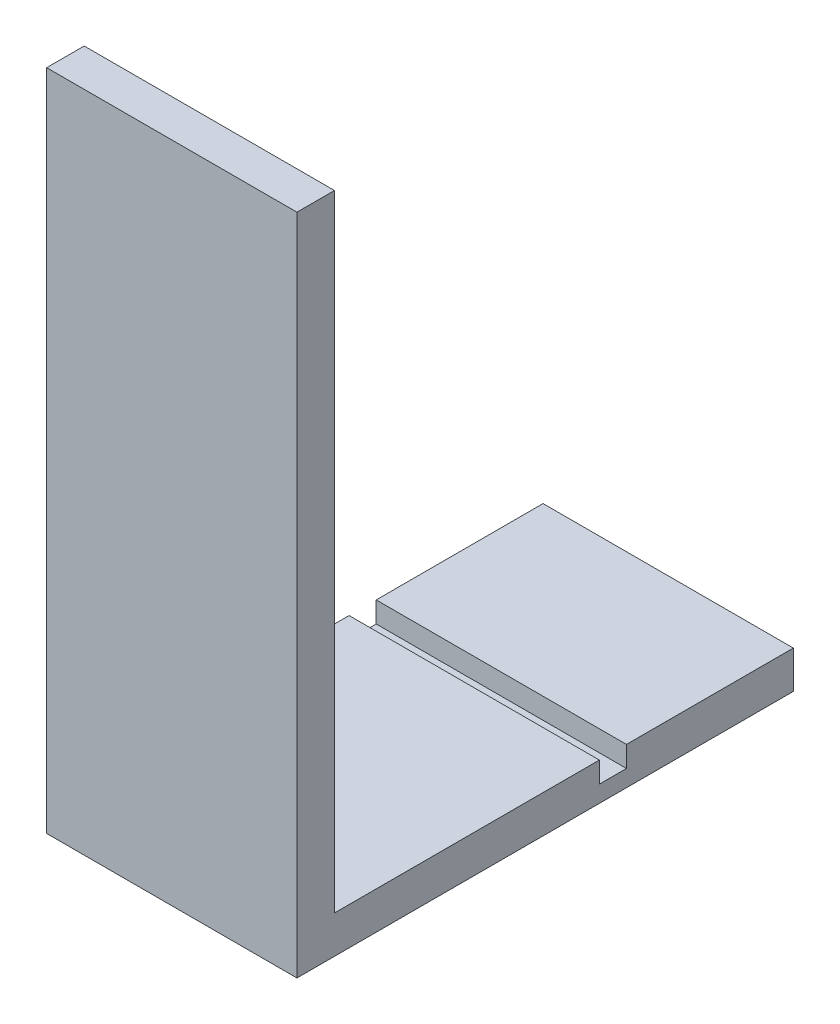
ISO-10303-21;
HEADER;
FILE_DESCRIPTION(('STEP AP214'),'2;1');
FILE_NAME('part.step','',(''),(''),'','','');
FILE_SCHEMA(('AUTOMOTIVE_DESIGN { 1 0 10303 214 1 1 1 1 }'));
ENDSEC;
DATA;
#1=APPLICATION_CONTEXT('core data for automotive mechanical design processes');
#2=APPLICATION_PROTOCOL_DEFINITION('international standard','automotive_design',2000,#1);
#3=PRODUCT_CONTEXT('',#1,'mechanical');
#4=PRODUCT('Part','Part','',(#3));
#5=PRODUCT_RELATED_PRODUCT_CATEGORY('part','',(#4));
#6=PRODUCT_DEFINITION_FORMATION('','',#4);
#7=PRODUCT_DEFINITION_CONTEXT('part definition',#1,'design');
#8=PRODUCT_DEFINITION('design','',#6,#7);
#9=PRODUCT_DEFINITION_SHAPE('','',#8);
#10=(LENGTH_UNIT() NAMED_UNIT(*) SI_UNIT(.MILLI.,.METRE.));
#11=(NAMED_UNIT(*) PLANE_ANGLE_UNIT() SI_UNIT($,.RADIAN.));
#12=(NAMED_UNIT(*) SI_UNIT($,.STERADIAN.) SOLID_ANGLE_UNIT());
#13=UNCERTAINTY_MEASURE_WITH_UNIT(LENGTH_MEASURE(1.E-05),#10,'distance_accuracy_value','');
#14=(GEOMETRIC_REPRESENTATION_CONTEXT(3) GLOBAL_UNCERTAINTY_ASSIGNED_CONTEXT((#13)) GLOBAL_UNIT_ASSIGNED_CONTEXT((#10,
#11,#12)) REPRESENTATION_CONTEXT('',''));
#15=CARTESIAN_POINT('',(0.,0.,0.));
#16=DIRECTION('',(0.,0.,1.));
#17=DIRECTION('',(1.,0.,0.));
#18=AXIS2_PLACEMENT_3D('',#15,#16,#17);
#19=CARTESIAN_POINT('',(120.,-58.6666666666666,-58.3333333333335));
#20=DIRECTION('',(0.,-1.,0.));
#21=DIRECTION('',(0.,0.,-1.));
#22=AXIS2_PLACEMENT_3D('',#19,#20,#21);
#23=PLANE('',#22);
#24=DIRECTION('',(0.,0.,1.));
#25=VECTOR('',#24,1.);
#26=CARTESIAN_POINT('',(0.,-58.6666666666666,-58.3333333333335));
#27=LINE('',#26,#25);
#28=CARTESIAN_POINT('',(0.,-58.6666666666666,-58.3333333333335));
#29=VERTEX_POINT('',#28);
#30=CARTESIAN_POINT('',(0.,-58.6666666666666,21.6666666666665));
#31=VERTEX_POINT('',#30);
#32=EDGE_CURVE('E166',#29,#31,#27,.T.);
#33=ORIENTED_EDGE('',*,*,#32,.T.);
#34=DIRECTION('',(1.,0.,0.));
#35=VECTOR('',#34,1.);
#36=CARTESIAN_POINT('',(0.,-58.6666666666666,21.6666666666665));
#37=LINE('',#36,#35);
#38=CARTESIAN_POINT('',(120.,-58.6666666666666,21.6666666666665));
#39=VERTEX_POINT('',#38);
#40=EDGE_CURVE('E144',#31,#39,#37,.T.);
#41=ORIENTED_EDGE('',*,*,#40,.T.);
#42=DIRECTION('',(0.,0.,1.));
#43=VECTOR('',#42,1.);
#44=CARTESIAN_POINT('',(120.,-58.6666666666666,-58.3333333333335));
#45=LINE('',#44,#43);
#46=CARTESIAN_POINT('',(120.,-58.6666666666666,-58.3333333333335));
#47=VERTEX_POINT('',#46);
#48=EDGE_CURVE('E121',#47,#39,#45,.T.);
#49=ORIENTED_EDGE('',*,*,#48,.F.);
#50=DIRECTION('',(-1.,0.,0.));
#51=VECTOR('',#50,1.);
#52=CARTESIAN_POINT('',(120.,-58.6666666666666,-58.3333333333335));
#53=LINE('',#52,#51);
#54=EDGE_CURVE('E131',#47,#29,#53,.T.);
#55=ORIENTED_EDGE('',*,*,#54,.T.);
#56=EDGE_LOOP('',(#33,#41,#49,#55));
#57=FACE_BOUND('',#56,.T.);
#58=ADVANCED_FACE('F45',(#57),#23,.F.);
#59=CARTESIAN_POINT('',(120.,241.333333333333,161.666666666667));
#60=DIRECTION('',(0.,-1.,0.));
#61=DIRECTION('',(0.,0.,-1.));
#62=AXIS2_PLACEMENT_3D('',#59,#60,#61);
#63=PLANE('',#62);
#64=DIRECTION('',(0.,0.,1.));
#65=VECTOR('',#64,1.);
#66=CARTESIAN_POINT('',(0.,241.333333333333,161.666666666667));
#67=LINE('',#66,#65);
#68=CARTESIAN_POINT('',(0.,241.333333333333,161.666666666667));
#69=VERTEX_POINT('',#68);
#70=CARTESIAN_POINT('',(0.,241.333333333333,179.666666666667));
#71=VERTEX_POINT('',#70);
#72=EDGE_CURVE('E153',#69,#71,#67,.T.);
#73=ORIENTED_EDGE('',*,*,#72,.T.);
#74=DIRECTION('',(-1.,0.,0.));
#75=VECTOR('',#74,1.);
#76=CARTESIAN_POINT('',(120.,241.333333333333,179.666666666667));
#77=LINE('',#76,#75);
#78=CARTESIAN_POINT('',(120.,241.333333333333,179.666666666667));
#79=VERTEX_POINT('',#78);
#80=EDGE_CURVE('E11',#79,#71,#77,.T.);
#81=ORIENTED_EDGE('',*,*,#80,.F.);
#82=DIRECTION('',(0.,0.,1.));
#83=VECTOR('',#82,1.);
#84=CARTESIAN_POINT('',(120.,241.333333333333,161.666666666667));
#85=LINE('',#84,#83);
#86=CARTESIAN_POINT('',(120.,241.333333333333,161.666666666667));
#87=VERTEX_POINT('',#86);
#88=EDGE_CURVE('E171',#87,#79,#85,.T.);
#89=ORIENTED_EDGE('',*,*,#88,.F.);
#90=DIRECTION('',(-1.,0.,0.));
#91=VECTOR('',#90,1.);
#92=CARTESIAN_POINT('',(120.,241.333333333333,161.666666666667));
#93=LINE('',#92,#91);
#94=EDGE_CURVE('E149',#87,#69,#93,.T.);
#95=ORIENTED_EDGE('',*,*,#94,.T.);
#96=EDGE_LOOP('',(#73,#81,#89,#95));
#97=FACE_BOUND('',#96,.T.);
#98=ADVANCED_FACE('F47',(#97),#63,.F.);
#99=CARTESIAN_POINT('',(120.,241.333333333333,179.666666666667));
#100=DIRECTION('',(0.,0.,-1.));
#101=DIRECTION('',(0.,1.,0.));
#102=AXIS2_PLACEMENT_3D('',#99,#100,#101);
#103=PLANE('',#102);
#104=DIRECTION('',(0.,-1.,0.));
#105=VECTOR('',#104,1.);
#106=CARTESIAN_POINT('',(0.,241.333333333333,179.666666666667));
#107=LINE('',#106,#105);
#108=CARTESIAN_POINT('',(0.,-76.6666666666666,179.666666666667));
#109=VERTEX_POINT('',#108);
#110=EDGE_CURVE('E157',#71,#109,#107,.T.);
#111=ORIENTED_EDGE('',*,*,#110,.T.);
#112=DIRECTION('',(-1.,0.,0.));
#113=VECTOR('',#112,1.);
#114=CARTESIAN_POINT('',(120.,-76.6666666666666,179.666666666667));
#115=LINE('',#114,#113);
#116=CARTESIAN_POINT('',(120.,-76.6666666666666,179.666666666667));
#117=VERTEX_POINT('',#116);
#118=EDGE_CURVE('E54',#117,#109,#115,.T.);
#119=ORIENTED_EDGE('',*,*,#118,.F.);
#120=DIRECTION('',(0.,-1.,0.));
#121=VECTOR('',#120,1.);
#122=CARTESIAN_POINT('',(120.,241.333333333333,179.666666666667));
#123=LINE('',#122,#121);
#124=EDGE_CURVE('E105',#79,#117,#123,.T.);
#125=ORIENTED_EDGE('',*,*,#124,.F.);
#126=ORIENTED_EDGE('',*,*,#80,.T.);
#127=EDGE_LOOP('',(#111,#119,#125,#126));
#128=FACE_BOUND('',#127,.T.);
#129=ADVANCED_FACE('F252',(#128),#103,.F.);
#130=CARTESIAN_POINT('',(120.,-76.6666666666666,179.666666666667));
#131=DIRECTION('',(0.,1.,0.));
#132=DIRECTION('',(0.,0.,1.));
#133=AXIS2_PLACEMENT_3D('',#130,#131,#132);
#134=PLANE('',#133);
#135=DIRECTION('',(0.,0.,-1.));
#136=VECTOR('',#135,1.);
#137=CARTESIAN_POINT('',(0.,-76.6666666666666,179.666666666667));
#138=LINE('',#137,#136);
#139=CARTESIAN_POINT('',(0.,-76.6666666666666,-58.3333333333335));
#140=VERTEX_POINT('',#139);
#141=EDGE_CURVE('E160',#109,#140,#138,.T.);
#142=ORIENTED_EDGE('',*,*,#141,.T.);
#143=DIRECTION('',(-1.,0.,0.));
#144=VECTOR('',#143,1.);
#145=CARTESIAN_POINT('',(120.,-76.6666666666666,-58.3333333333335));
#146=LINE('',#145,#144);
#147=CARTESIAN_POINT('',(120.,-76.6666666666666,-58.3333333333335));
#148=VERTEX_POINT('',#147);
#149=EDGE_CURVE('E139',#148,#140,#146,.T.);
#150=ORIENTED_EDGE('',*,*,#149,.F.);
#151=DIRECTION('',(0.,0.,-1.));
#152=VECTOR('',#151,1.);
#153=CARTESIAN_POINT('',(120.,-76.6666666666666,179.666666666667));
#154=LINE('',#153,#152);
#155=EDGE_CURVE('E123',#117,#148,#154,.T.);
#156=ORIENTED_EDGE('',*,*,#155,.F.);
#157=ORIENTED_EDGE('',*,*,#118,.T.);
#158=EDGE_LOOP('',(#142,#150,#156,#157));
#159=FACE_BOUND('',#158,.T.);
#160=ADVANCED_FACE('F181',(#159),#134,.F.);
#161=CARTESIAN_POINT('',(120.,-76.6666666666666,-58.3333333333335));
#162=DIRECTION('',(0.,0.,1.));
#163=DIRECTION('',(1.,0.,0.));
#164=AXIS2_PLACEMENT_3D('',#161,#162,#163);
#165=PLANE('',#164);
#166=DIRECTION('',(0.,1.,0.));
#167=VECTOR('',#166,1.);
#168=CARTESIAN_POINT('',(0.,-76.6666666666666,-58.3333333333335));
#169=LINE('',#168,#167);
#170=EDGE_CURVE('E134',#140,#29,#169,.T.);
#171=ORIENTED_EDGE('',*,*,#170,.T.);
#172=ORIENTED_EDGE('',*,*,#54,.F.);
#173=DIRECTION('',(0.,1.,0.));
#174=VECTOR('',#173,1.);
#175=CARTESIAN_POINT('',(120.,-76.6666666666666,-58.3333333333335));
#176=LINE('',#175,#174);
#177=EDGE_CURVE('E116',#148,#47,#176,.T.);
#178=ORIENTED_EDGE('',*,*,#177,.F.);
#179=ORIENTED_EDGE('',*,*,#149,.T.);
#180=EDGE_LOOP('',(#171,#172,#178,#179));
#181=FACE_BOUND('',#180,.T.);
#182=ADVANCED_FACE('F132',(#181),#165,.F.);
#183=CARTESIAN_POINT('',(120.,-58.6666666666666,34.6666666666665));
#184=VERTEX_POINT('',#183);
#185=CARTESIAN_POINT('',(120.,-58.6666666666666,161.666666666667));
#186=VERTEX_POINT('',#185);
#187=EDGE_CURVE('E128',#184,#186,#45,.T.);
#188=ORIENTED_EDGE('',*,*,#187,.F.);
#189=DIRECTION('',(1.,0.,0.));
#190=VECTOR('',#189,1.);
#191=CARTESIAN_POINT('',(0.,-58.6666666666666,34.6666666666665));
#192=LINE('',#191,#190);
#193=CARTESIAN_POINT('',(0.,-58.6666666666666,34.6666666666665));
#194=VERTEX_POINT('',#193);
#195=EDGE_CURVE('E212',#194,#184,#192,.T.);
#196=ORIENTED_EDGE('',*,*,#195,.F.);
#197=CARTESIAN_POINT('',(0.,-58.6666666666666,161.666666666667));
#198=VERTEX_POINT('',#197);
#199=EDGE_CURVE('E165',#194,#198,#27,.T.);
#200=ORIENTED_EDGE('',*,*,#199,.T.);
#201=DIRECTION('',(-1.,0.,0.));
#202=VECTOR('',#201,1.);
#203=CARTESIAN_POINT('',(120.,-58.6666666666666,161.666666666667));
#204=LINE('',#203,#202);
#205=EDGE_CURVE('E140',#186,#198,#204,.T.);
#206=ORIENTED_EDGE('',*,*,#205,.F.);
#207=EDGE_LOOP('',(#188,#196,#200,#206));
#208=FACE_BOUND('',#207,.T.);
#209=ADVANCED_FACE('F220',(#208),#23,.F.);
#210=CARTESIAN_POINT('',(120.,-58.6666666666666,161.666666666667));
#211=DIRECTION('',(0.,0.,1.));
#212=DIRECTION('',(0.,-1.,0.));
#213=AXIS2_PLACEMENT_3D('',#210,#211,#212);
#214=PLANE('',#213);
#215=DIRECTION('',(0.,1.,0.));
#216=VECTOR('',#215,1.);
#217=CARTESIAN_POINT('',(0.,-58.6666666666666,161.666666666667));
#218=LINE('',#217,#216);
#219=EDGE_CURVE('E97',#198,#69,#218,.T.);
#220=ORIENTED_EDGE('',*,*,#219,.T.);
#221=ORIENTED_EDGE('',*,*,#94,.F.);
#222=DIRECTION('',(0.,1.,0.));
#223=VECTOR('',#222,1.);
#224=CARTESIAN_POINT('',(120.,-58.6666666666666,161.666666666667));
#225=LINE('',#224,#223);
#226=EDGE_CURVE('E70',#186,#87,#225,.T.);
#227=ORIENTED_EDGE('',*,*,#226,.F.);
#228=ORIENTED_EDGE('',*,*,#205,.T.);
#229=EDGE_LOOP('',(#220,#221,#227,#228));
#230=FACE_BOUND('',#229,.T.);
#231=ADVANCED_FACE('F267',(#230),#214,.F.);
#232=CARTESIAN_POINT('',(120.,0.,0.));
#233=DIRECTION('',(1.,0.,0.));
#234=DIRECTION('',(0.,0.,-1.));
#235=AXIS2_PLACEMENT_3D('',#232,#233,#234);
#236=PLANE('',#235);
#237=DIRECTION('',(0.,1.,0.));
#238=VECTOR('',#237,1.);
#239=CARTESIAN_POINT('',(120.,-68.6666666666666,21.6666666666665));
#240=LINE('',#239,#238);
#241=CARTESIAN_POINT('',(120.,-68.6666666666666,21.6666666666665));
#242=VERTEX_POINT('',#241);
#243=EDGE_CURVE('E204',#242,#39,#240,.T.);
#244=ORIENTED_EDGE('',*,*,#243,.F.);
#245=DIRECTION('',(0.,0.,-1.));
#246=VECTOR('',#245,1.);
#247=CARTESIAN_POINT('',(120.,-68.6666666666666,34.6666666666665));
#248=LINE('',#247,#246);
#249=CARTESIAN_POINT('',(120.,-68.6666666666666,34.6666666666665));
#250=VERTEX_POINT('',#249);
#251=EDGE_CURVE('E237',#250,#242,#248,.T.);
#252=ORIENTED_EDGE('',*,*,#251,.F.);
#253=DIRECTION('',(0.,-1.,0.));
#254=VECTOR('',#253,1.);
#255=CARTESIAN_POINT('',(120.,-58.6666666666666,34.6666666666665));
#256=LINE('',#255,#254);
#257=EDGE_CURVE('E240',#184,#250,#256,.T.);
#258=ORIENTED_EDGE('',*,*,#257,.F.);
#259=ORIENTED_EDGE('',*,*,#187,.T.);
#260=ORIENTED_EDGE('',*,*,#226,.T.);
#261=ORIENTED_EDGE('',*,*,#88,.T.);
#262=ORIENTED_EDGE('',*,*,#124,.T.);
#263=ORIENTED_EDGE('',*,*,#155,.T.);
#264=ORIENTED_EDGE('',*,*,#177,.T.);
#265=ORIENTED_EDGE('',*,*,#48,.T.);
#266=EDGE_LOOP('',(#244,#252,#258,#259,#260,#261,#262,#263,#264,#265));
#267=FACE_BOUND('',#266,.T.);
#268=ADVANCED_FACE('F119',(#267),#236,.T.);
#269=CARTESIAN_POINT('',(0.,0.,0.));
#270=DIRECTION('',(1.,0.,0.));
#271=DIRECTION('',(0.,0.,-1.));
#272=AXIS2_PLACEMENT_3D('',#269,#270,#271);
#273=PLANE('',#272);
#274=DIRECTION('',(0.,0.,-1.));
#275=VECTOR('',#274,1.);
#276=CARTESIAN_POINT('',(0.,-68.6666666666666,34.6666666666665));
#277=LINE('',#276,#275);
#278=CARTESIAN_POINT('',(0.,-68.6666666666666,34.6666666666665));
#279=VERTEX_POINT('',#278);
#280=CARTESIAN_POINT('',(0.,-68.6666666666666,21.6666666666665));
#281=VERTEX_POINT('',#280);
#282=EDGE_CURVE('E61',#279,#281,#277,.T.);
#283=ORIENTED_EDGE('',*,*,#282,.T.);
#284=DIRECTION('',(0.,1.,0.));
#285=VECTOR('',#284,1.);
#286=CARTESIAN_POINT('',(0.,-68.6666666666666,21.6666666666665));
#287=LINE('',#286,#285);
#288=EDGE_CURVE('E187',#281,#31,#287,.T.);
#289=ORIENTED_EDGE('',*,*,#288,.T.);
#290=ORIENTED_EDGE('',*,*,#32,.F.);
#291=ORIENTED_EDGE('',*,*,#170,.F.);
#292=ORIENTED_EDGE('',*,*,#141,.F.);
#293=ORIENTED_EDGE('',*,*,#110,.F.);
#294=ORIENTED_EDGE('',*,*,#72,.F.);
#295=ORIENTED_EDGE('',*,*,#219,.F.);
#296=ORIENTED_EDGE('',*,*,#199,.F.);
#297=DIRECTION('',(0.,-1.,0.));
#298=VECTOR('',#297,1.);
#299=CARTESIAN_POINT('',(0.,-58.6666666666666,34.6666666666665));
#300=LINE('',#299,#298);
#301=EDGE_CURVE('E208',#194,#279,#300,.T.);
#302=ORIENTED_EDGE('',*,*,#301,.T.);
#303=EDGE_LOOP('',(#283,#289,#290,#291,#292,#293,#294,#295,#296,#302));
#304=FACE_BOUND('',#303,.T.);
#305=ADVANCED_FACE('F183',(#304),#273,.F.);
#306=CARTESIAN_POINT('',(0.,-68.6666666666666,21.6666666666665));
#307=DIRECTION('',(0.,0.,-1.));
#308=DIRECTION('',(-1.,0.,0.));
#309=AXIS2_PLACEMENT_3D('',#306,#307,#308);
#310=PLANE('',#309);
#311=ORIENTED_EDGE('',*,*,#243,.T.);
#312=ORIENTED_EDGE('',*,*,#40,.F.);
#313=ORIENTED_EDGE('',*,*,#288,.F.);
#314=DIRECTION('',(1.,0.,0.));
#315=VECTOR('',#314,1.);
#316=CARTESIAN_POINT('',(0.,-68.6666666666666,21.6666666666665));
#317=LINE('',#316,#315);
#318=EDGE_CURVE('E202',#281,#242,#317,.T.);
#319=ORIENTED_EDGE('',*,*,#318,.T.);
#320=EDGE_LOOP('',(#311,#312,#313,#319));
#321=FACE_BOUND('',#320,.T.);
#322=ADVANCED_FACE('F301',(#321),#310,.F.);
#323=CARTESIAN_POINT('',(0.,-68.6666666666666,34.6666666666665));
#324=DIRECTION('',(0.,-1.,0.));
#325=DIRECTION('',(0.,0.,-1.));
#326=AXIS2_PLACEMENT_3D('',#323,#324,#325);
#327=PLANE('',#326);
#328=ORIENTED_EDGE('',*,*,#251,.T.);
#329=ORIENTED_EDGE('',*,*,#318,.F.);
#330=ORIENTED_EDGE('',*,*,#282,.F.);
#331=DIRECTION('',(1.,0.,0.));
#332=VECTOR('',#331,1.);
#333=CARTESIAN_POINT('',(0.,-68.6666666666666,34.6666666666665));
#334=LINE('',#333,#332);
#335=EDGE_CURVE('E214',#279,#250,#334,.T.);
#336=ORIENTED_EDGE('',*,*,#335,.T.);
#337=EDGE_LOOP('',(#328,#329,#330,#336));
#338=FACE_BOUND('',#337,.T.);
#339=ADVANCED_FACE('F314',(#338),#327,.F.);
#340=CARTESIAN_POINT('',(0.,-58.6666666666666,34.6666666666665));
#341=DIRECTION('',(0.,0.,1.));
#342=DIRECTION('',(1.,0.,0.));
#343=AXIS2_PLACEMENT_3D('',#340,#341,#342);
#344=PLANE('',#343);
#345=ORIENTED_EDGE('',*,*,#257,.T.);
#346=ORIENTED_EDGE('',*,*,#335,.F.);
#347=ORIENTED_EDGE('',*,*,#301,.F.);
#348=ORIENTED_EDGE('',*,*,#195,.T.);
#349=EDGE_LOOP('',(#345,#346,#347,#348));
#350=FACE_BOUND('',#349,.T.);
#351=ADVANCED_FACE('F211',(#350),#344,.F.);
#352=CLOSED_SHELL('',(#58,#98,#129,#160,#182,#209,#231,#268,#305,#322,#339,#351));
#353=MANIFOLD_SOLID_BREP('B2',#352);
#354=ADVANCED_BREP_SHAPE_REPRESENTATION('',(#18,#353),#14);
#355=SHAPE_DEFINITION_REPRESENTATION(#9,#354);
ENDSEC;
END-ISO-10303-21;
